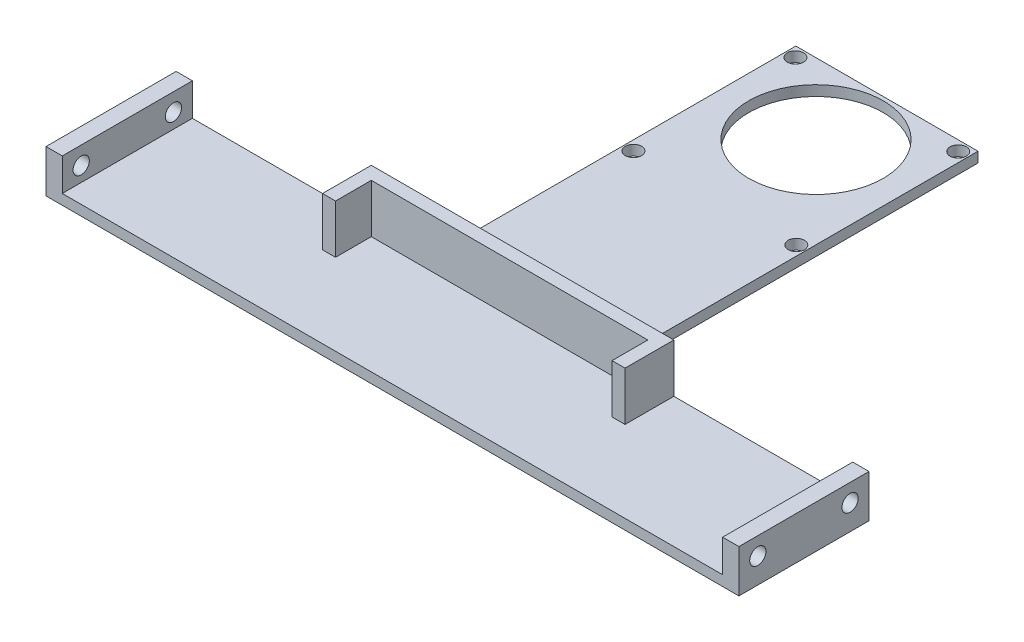
ISO-10303-21;
HEADER;
FILE_DESCRIPTION(('STEP AP214'),'2;1');
FILE_NAME('part.step','',(''),(''),'','','');
FILE_SCHEMA(('AUTOMOTIVE_DESIGN { 1 0 10303 214 1 1 1 1 }'));
ENDSEC;
DATA;
#1=APPLICATION_CONTEXT('core data for automotive mechanical design processes');
#2=APPLICATION_PROTOCOL_DEFINITION('international standard','automotive_design',2000,#1);
#3=PRODUCT_CONTEXT('',#1,'mechanical');
#4=PRODUCT('Part','Part','',(#3));
#5=PRODUCT_RELATED_PRODUCT_CATEGORY('part','',(#4));
#6=PRODUCT_DEFINITION_FORMATION('','',#4);
#7=PRODUCT_DEFINITION_CONTEXT('part definition',#1,'design');
#8=PRODUCT_DEFINITION('design','',#6,#7);
#9=PRODUCT_DEFINITION_SHAPE('','',#8);
#10=(LENGTH_UNIT() NAMED_UNIT(*) SI_UNIT(.MILLI.,.METRE.));
#11=(NAMED_UNIT(*) PLANE_ANGLE_UNIT() SI_UNIT($,.RADIAN.));
#12=(NAMED_UNIT(*) SI_UNIT($,.STERADIAN.) SOLID_ANGLE_UNIT());
#13=UNCERTAINTY_MEASURE_WITH_UNIT(LENGTH_MEASURE(1.E-05),#10,'distance_accuracy_value','');
#14=(GEOMETRIC_REPRESENTATION_CONTEXT(3) GLOBAL_UNCERTAINTY_ASSIGNED_CONTEXT((#13)) GLOBAL_UNIT_ASSIGNED_CONTEXT((#10,
#11,#12)) REPRESENTATION_CONTEXT('',''));
#15=CARTESIAN_POINT('',(0.,0.,0.));
#16=DIRECTION('',(0.,0.,1.));
#17=DIRECTION('',(1.,0.,0.));
#18=AXIS2_PLACEMENT_3D('',#15,#16,#17);
#19=CARTESIAN_POINT('',(56.515,2.,-167.64));
#20=DIRECTION('',(0.,0.,1.));
#21=DIRECTION('',(1.,0.,0.));
#22=AXIS2_PLACEMENT_3D('',#19,#20,#21);
#23=PLANE('',#22);
#24=DIRECTION('',(0.,-1.,0.));
#25=VECTOR('',#24,1.);
#26=CARTESIAN_POINT('',(44.7675,2.,-167.64));
#27=LINE('',#26,#25);
#28=CARTESIAN_POINT('',(44.7675,4.54,-167.64));
#29=VERTEX_POINT('',#28);
#30=CARTESIAN_POINT('',(44.7675,0.,-167.64));
#31=VERTEX_POINT('',#30);
#32=EDGE_CURVE('E61',#29,#31,#27,.T.);
#33=ORIENTED_EDGE('',*,*,#32,.F.);
#34=DIRECTION('',(1.,0.,0.));
#35=VECTOR('',#34,1.);
#36=CARTESIAN_POINT('',(56.515,4.54,-167.64));
#37=LINE('',#36,#35);
#38=CARTESIAN_POINT('',(9.20750000000003,4.54,-167.64));
#39=VERTEX_POINT('',#38);
#40=EDGE_CURVE('E446',#29,#39,#37,.F.);
#41=ORIENTED_EDGE('',*,*,#40,.T.);
#42=DIRECTION('',(0.,-1.,0.));
#43=VECTOR('',#42,1.);
#44=CARTESIAN_POINT('',(9.20750000000003,2.,-167.64));
#45=LINE('',#44,#43);
#46=CARTESIAN_POINT('',(9.20750000000004,0.,-167.64));
#47=VERTEX_POINT('',#46);
#48=EDGE_CURVE('E68',#39,#47,#45,.T.);
#49=ORIENTED_EDGE('',*,*,#48,.T.);
#50=DIRECTION('',(-1.,0.,0.));
#51=VECTOR('',#50,1.);
#52=CARTESIAN_POINT('',(56.515,0.,-167.64));
#53=LINE('',#52,#51);
#54=CARTESIAN_POINT('',(-40.6399999999999,0.,-167.64));
#55=VERTEX_POINT('',#54);
#56=EDGE_CURVE('E435',#47,#55,#53,.T.);
#57=ORIENTED_EDGE('',*,*,#56,.T.);
#58=DIRECTION('',(0.,-1.,0.));
#59=VECTOR('',#58,1.);
#60=CARTESIAN_POINT('',(-40.6399999999999,2.,-167.64));
#61=LINE('',#60,#59);
#62=CARTESIAN_POINT('',(-40.6399999999999,8.35,-167.64));
#63=VERTEX_POINT('',#62);
#64=EDGE_CURVE('E283',#63,#55,#61,.T.);
#65=ORIENTED_EDGE('',*,*,#64,.F.);
#66=DIRECTION('',(-1.,0.,0.));
#67=VECTOR('',#66,1.);
#68=CARTESIAN_POINT('',(53.9750000000001,8.35,-167.64));
#69=LINE('',#68,#67);
#70=CARTESIAN_POINT('',(-37.4649999999999,8.35,-167.64));
#71=VERTEX_POINT('',#70);
#72=EDGE_CURVE('E261',#71,#63,#69,.T.);
#73=ORIENTED_EDGE('',*,*,#72,.F.);
#74=DIRECTION('',(0.,-1.,0.));
#75=VECTOR('',#74,1.);
#76=CARTESIAN_POINT('',(-37.4649999999999,8.35,-167.64));
#77=LINE('',#76,#75);
#78=CARTESIAN_POINT('',(-37.4649999999999,2.,-167.64));
#79=VERTEX_POINT('',#78);
#80=EDGE_CURVE('E269',#71,#79,#77,.T.);
#81=ORIENTED_EDGE('',*,*,#80,.T.);
#82=DIRECTION('',(1.,0.,0.));
#83=VECTOR('',#82,1.);
#84=CARTESIAN_POINT('',(-2.53999999999989,2.,-167.64));
#85=LINE('',#84,#83);
#86=CARTESIAN_POINT('',(-2.54,2.,-167.64));
#87=VERTEX_POINT('',#86);
#88=EDGE_CURVE('E276',#79,#87,#85,.T.);
#89=ORIENTED_EDGE('',*,*,#88,.T.);
#90=DIRECTION('',(0.,-1.,0.));
#91=VECTOR('',#90,1.);
#92=CARTESIAN_POINT('',(-2.54,2.,-167.64));
#93=LINE('',#92,#91);
#94=CARTESIAN_POINT('',(-2.54,11.525,-167.64));
#95=VERTEX_POINT('',#94);
#96=EDGE_CURVE('E431',#95,#87,#93,.T.);
#97=ORIENTED_EDGE('',*,*,#96,.F.);
#98=DIRECTION('',(1.,0.,0.));
#99=VECTOR('',#98,1.);
#100=CARTESIAN_POINT('',(0.,11.525,-167.64));
#101=LINE('',#100,#99);
#102=CARTESIAN_POINT('',(56.515,11.525,-167.64));
#103=VERTEX_POINT('',#102);
#104=EDGE_CURVE('E360',#95,#103,#101,.T.);
#105=ORIENTED_EDGE('',*,*,#104,.T.);
#106=DIRECTION('',(0.,-1.,0.));
#107=VECTOR('',#106,1.);
#108=CARTESIAN_POINT('',(56.515,2.,-167.64));
#109=LINE('',#108,#107);
#110=CARTESIAN_POINT('',(56.515,2.,-167.64));
#111=VERTEX_POINT('',#110);
#112=EDGE_CURVE('E440',#103,#111,#109,.T.);
#113=ORIENTED_EDGE('',*,*,#112,.T.);
#114=DIRECTION('',(-1.,0.,0.));
#115=VECTOR('',#114,1.);
#116=CARTESIAN_POINT('',(56.515,2.,-167.64));
#117=LINE('',#116,#115);
#118=CARTESIAN_POINT('',(91.44,2.,-167.64));
#119=VERTEX_POINT('',#118);
#120=EDGE_CURVE('E338',#119,#111,#117,.T.);
#121=ORIENTED_EDGE('',*,*,#120,.F.);
#122=DIRECTION('',(0.,-1.,0.));
#123=VECTOR('',#122,1.);
#124=CARTESIAN_POINT('',(91.44,8.35,-167.64));
#125=LINE('',#124,#123);
#126=CARTESIAN_POINT('',(91.44,8.35,-167.64));
#127=VERTEX_POINT('',#126);
#128=EDGE_CURVE('E330',#127,#119,#125,.T.);
#129=ORIENTED_EDGE('',*,*,#128,.F.);
#130=DIRECTION('',(1.,0.,0.));
#131=VECTOR('',#130,1.);
#132=CARTESIAN_POINT('',(0.,8.35,-167.64));
#133=LINE('',#132,#131);
#134=CARTESIAN_POINT('',(94.615,8.35,-167.64));
#135=VERTEX_POINT('',#134);
#136=EDGE_CURVE('E323',#127,#135,#133,.T.);
#137=ORIENTED_EDGE('',*,*,#136,.T.);
#138=DIRECTION('',(0.,-1.,0.));
#139=VECTOR('',#138,1.);
#140=CARTESIAN_POINT('',(94.615,2.,-167.64));
#141=LINE('',#140,#139);
#142=CARTESIAN_POINT('',(94.615,0.,-167.64));
#143=VERTEX_POINT('',#142);
#144=EDGE_CURVE('E344',#135,#143,#141,.T.);
#145=ORIENTED_EDGE('',*,*,#144,.T.);
#146=EDGE_CURVE('E432',#143,#31,#53,.T.);
#147=ORIENTED_EDGE('',*,*,#146,.T.);
#148=EDGE_LOOP('',(#33,#41,#49,#57,#65,#73,#81,#89,#97,#105,#113,#121,#129,#137,#145,#147));
#149=FACE_BOUND('',#148,.T.);
#150=ADVANCED_FACE('F45',(#149),#23,.F.);
#151=CARTESIAN_POINT('',(56.515,2.,-142.24));
#152=DIRECTION('',(-1.,0.,0.));
#153=DIRECTION('',(0.,0.,1.));
#154=AXIS2_PLACEMENT_3D('',#151,#152,#153);
#155=PLANE('',#154);
#156=DIRECTION('',(0.,0.,1.));
#157=VECTOR('',#156,1.);
#158=CARTESIAN_POINT('',(56.515,2.,-167.64));
#159=LINE('',#158,#157);
#160=CARTESIAN_POINT('',(56.515,2.,-158.115));
#161=VERTEX_POINT('',#160);
#162=EDGE_CURVE('E341',#111,#161,#159,.T.);
#163=ORIENTED_EDGE('',*,*,#162,.F.);
#164=ORIENTED_EDGE('',*,*,#112,.F.);
#165=DIRECTION('',(0.,0.,1.));
#166=VECTOR('',#165,1.);
#167=CARTESIAN_POINT('',(56.515,11.525,0.));
#168=LINE('',#167,#166);
#169=CARTESIAN_POINT('',(56.515,11.525,-158.115));
#170=VERTEX_POINT('',#169);
#171=EDGE_CURVE('E365',#103,#170,#168,.T.);
#172=ORIENTED_EDGE('',*,*,#171,.T.);
#173=DIRECTION('',(0.,-1.,0.));
#174=VECTOR('',#173,1.);
#175=CARTESIAN_POINT('',(56.515,11.525,-158.115));
#176=LINE('',#175,#174);
#177=EDGE_CURVE('E389',#170,#161,#176,.T.);
#178=ORIENTED_EDGE('',*,*,#177,.T.);
#179=EDGE_LOOP('',(#163,#164,#172,#178));
#180=FACE_BOUND('',#179,.T.);
#181=ADVANCED_FACE('F506',(#180),#155,.F.);
#182=CARTESIAN_POINT('',(0.,2.,0.));
#183=DIRECTION('',(0.,1.,0.));
#184=DIRECTION('',(0.,0.,1.));
#185=AXIS2_PLACEMENT_3D('',#182,#183,#184);
#186=PLANE('',#185);
#187=DIRECTION('',(1.,0.,0.));
#188=VECTOR('',#187,1.);
#189=CARTESIAN_POINT('',(-2.54,2.,-142.24));
#190=LINE('',#189,#188);
#191=CARTESIAN_POINT('',(-37.4649999999999,2.,-142.24));
#192=VERTEX_POINT('',#191);
#193=CARTESIAN_POINT('',(91.44,2.,-142.24));
#194=VERTEX_POINT('',#193);
#195=EDGE_CURVE('E428',#192,#194,#190,.T.);
#196=ORIENTED_EDGE('',*,*,#195,.T.);
#197=DIRECTION('',(0.,0.,-1.));
#198=VECTOR('',#197,1.);
#199=CARTESIAN_POINT('',(91.44,2.,0.));
#200=LINE('',#199,#198);
#201=EDGE_CURVE('E304',#194,#119,#200,.T.);
#202=ORIENTED_EDGE('',*,*,#201,.T.);
#203=ORIENTED_EDGE('',*,*,#120,.T.);
#204=ORIENTED_EDGE('',*,*,#162,.T.);
#205=DIRECTION('',(-1.,0.,0.));
#206=VECTOR('',#205,1.);
#207=CARTESIAN_POINT('',(0.,2.,-158.115));
#208=LINE('',#207,#206);
#209=CARTESIAN_POINT('',(53.975,2.,-158.115));
#210=VERTEX_POINT('',#209);
#211=EDGE_CURVE('E355',#161,#210,#208,.T.);
#212=ORIENTED_EDGE('',*,*,#211,.T.);
#213=DIRECTION('',(0.,0.,-1.));
#214=VECTOR('',#213,1.);
#215=CARTESIAN_POINT('',(53.975,2.,0.));
#216=LINE('',#215,#214);
#217=CARTESIAN_POINT('',(53.975,2.,-165.1));
#218=VERTEX_POINT('',#217);
#219=EDGE_CURVE('E393',#210,#218,#216,.T.);
#220=ORIENTED_EDGE('',*,*,#219,.T.);
#221=DIRECTION('',(-1.,0.,0.));
#222=VECTOR('',#221,1.);
#223=CARTESIAN_POINT('',(0.,2.,-165.1));
#224=LINE('',#223,#222);
#225=CARTESIAN_POINT('',(0.,2.,-165.1));
#226=VERTEX_POINT('',#225);
#227=EDGE_CURVE('E397',#218,#226,#224,.T.);
#228=ORIENTED_EDGE('',*,*,#227,.T.);
#229=DIRECTION('',(0.,0.,1.));
#230=VECTOR('',#229,1.);
#231=CARTESIAN_POINT('',(0.,2.,0.));
#232=LINE('',#231,#230);
#233=CARTESIAN_POINT('',(0.,2.,-158.115));
#234=VERTEX_POINT('',#233);
#235=EDGE_CURVE('E401',#226,#234,#232,.T.);
#236=ORIENTED_EDGE('',*,*,#235,.T.);
#237=DIRECTION('',(-1.,0.,0.));
#238=VECTOR('',#237,1.);
#239=CARTESIAN_POINT('',(0.,2.,-158.115));
#240=LINE('',#239,#238);
#241=CARTESIAN_POINT('',(-2.54,2.,-158.115));
#242=VERTEX_POINT('',#241);
#243=EDGE_CURVE('E361',#234,#242,#240,.T.);
#244=ORIENTED_EDGE('',*,*,#243,.T.);
#245=DIRECTION('',(0.,0.,1.));
#246=VECTOR('',#245,1.);
#247=CARTESIAN_POINT('',(-2.53999999999989,2.,-167.64));
#248=LINE('',#247,#246);
#249=EDGE_CURVE('E280',#87,#242,#248,.T.);
#250=ORIENTED_EDGE('',*,*,#249,.F.);
#251=ORIENTED_EDGE('',*,*,#88,.F.);
#252=DIRECTION('',(0.,0.,-1.));
#253=VECTOR('',#252,1.);
#254=CARTESIAN_POINT('',(-37.4649999999999,2.,0.));
#255=LINE('',#254,#253);
#256=EDGE_CURVE('E244',#192,#79,#255,.T.);
#257=ORIENTED_EDGE('',*,*,#256,.F.);
#258=EDGE_LOOP('',(#196,#202,#203,#204,#212,#220,#228,#236,#244,#250,#251,#257));
#259=FACE_BOUND('',#258,.T.);
#260=ADVANCED_FACE('F475',(#259),#186,.T.);
#261=CARTESIAN_POINT('',(-2.54,2.,-167.64));
#262=DIRECTION('',(1.,0.,0.));
#263=DIRECTION('',(0.,0.,-1.));
#264=AXIS2_PLACEMENT_3D('',#261,#262,#263);
#265=PLANE('',#264);
#266=ORIENTED_EDGE('',*,*,#96,.T.);
#267=ORIENTED_EDGE('',*,*,#249,.T.);
#268=DIRECTION('',(0.,-1.,0.));
#269=VECTOR('',#268,1.);
#270=CARTESIAN_POINT('',(-2.54,11.525,-158.115));
#271=LINE('',#270,#269);
#272=CARTESIAN_POINT('',(-2.54,11.525,-158.115));
#273=VERTEX_POINT('',#272);
#274=EDGE_CURVE('E408',#273,#242,#271,.T.);
#275=ORIENTED_EDGE('',*,*,#274,.F.);
#276=DIRECTION('',(0.,0.,-1.));
#277=VECTOR('',#276,1.);
#278=CARTESIAN_POINT('',(-2.54,11.525,0.));
#279=LINE('',#278,#277);
#280=EDGE_CURVE('E356',#273,#95,#279,.T.);
#281=ORIENTED_EDGE('',*,*,#280,.T.);
#282=EDGE_LOOP('',(#266,#267,#275,#281));
#283=FACE_BOUND('',#282,.T.);
#284=ADVANCED_FACE('F485',(#283),#265,.F.);
#285=CARTESIAN_POINT('',(-2.54,2.,-142.24));
#286=DIRECTION('',(0.,0.,-1.));
#287=DIRECTION('',(-1.,0.,0.));
#288=AXIS2_PLACEMENT_3D('',#285,#286,#287);
#289=PLANE('',#288);
#290=DIRECTION('',(1.,0.,0.));
#291=VECTOR('',#290,1.);
#292=CARTESIAN_POINT('',(-2.54,0.,-142.24));
#293=LINE('',#292,#291);
#294=CARTESIAN_POINT('',(-40.6399999999999,0.,-142.24));
#295=VERTEX_POINT('',#294);
#296=CARTESIAN_POINT('',(94.615,0.,-142.24));
#297=VERTEX_POINT('',#296);
#298=EDGE_CURVE('E412',#295,#297,#293,.T.);
#299=ORIENTED_EDGE('',*,*,#298,.T.);
#300=DIRECTION('',(0.,-1.,0.));
#301=VECTOR('',#300,1.);
#302=CARTESIAN_POINT('',(94.615,2.,-142.24));
#303=LINE('',#302,#301);
#304=CARTESIAN_POINT('',(94.615,8.35,-142.24));
#305=VERTEX_POINT('',#304);
#306=EDGE_CURVE('E351',#305,#297,#303,.T.);
#307=ORIENTED_EDGE('',*,*,#306,.F.);
#308=DIRECTION('',(-1.,0.,0.));
#309=VECTOR('',#308,1.);
#310=CARTESIAN_POINT('',(0.,8.35,-142.24));
#311=LINE('',#310,#309);
#312=CARTESIAN_POINT('',(91.44,8.35,-142.24));
#313=VERTEX_POINT('',#312);
#314=EDGE_CURVE('E315',#305,#313,#311,.T.);
#315=ORIENTED_EDGE('',*,*,#314,.T.);
#316=DIRECTION('',(0.,-1.,0.));
#317=VECTOR('',#316,1.);
#318=CARTESIAN_POINT('',(91.44,8.35,-142.24));
#319=LINE('',#318,#317);
#320=EDGE_CURVE('E327',#313,#194,#319,.T.);
#321=ORIENTED_EDGE('',*,*,#320,.T.);
#322=ORIENTED_EDGE('',*,*,#195,.F.);
#323=DIRECTION('',(0.,-1.,0.));
#324=VECTOR('',#323,1.);
#325=CARTESIAN_POINT('',(-37.4649999999999,8.35,-142.24));
#326=LINE('',#325,#324);
#327=CARTESIAN_POINT('',(-37.4649999999999,8.35,-142.24));
#328=VERTEX_POINT('',#327);
#329=EDGE_CURVE('E265',#328,#192,#326,.T.);
#330=ORIENTED_EDGE('',*,*,#329,.F.);
#331=DIRECTION('',(1.,0.,0.));
#332=VECTOR('',#331,1.);
#333=CARTESIAN_POINT('',(53.9750000000001,8.35,-142.24));
#334=LINE('',#333,#332);
#335=CARTESIAN_POINT('',(-40.6399999999999,8.35,-142.24));
#336=VERTEX_POINT('',#335);
#337=EDGE_CURVE('E254',#336,#328,#334,.T.);
#338=ORIENTED_EDGE('',*,*,#337,.F.);
#339=DIRECTION('',(0.,-1.,0.));
#340=VECTOR('',#339,1.);
#341=CARTESIAN_POINT('',(-40.6399999999999,2.,-142.24));
#342=LINE('',#341,#340);
#343=EDGE_CURVE('E290',#336,#295,#342,.T.);
#344=ORIENTED_EDGE('',*,*,#343,.T.);
#345=EDGE_LOOP('',(#299,#307,#315,#321,#322,#330,#338,#344));
#346=FACE_BOUND('',#345,.T.);
#347=ADVANCED_FACE('F580',(#346),#289,.F.);
#348=CARTESIAN_POINT('',(0.,0.,0.));
#349=DIRECTION('',(0.,1.,0.));
#350=DIRECTION('',(0.,0.,1.));
#351=AXIS2_PLACEMENT_3D('',#348,#349,#350);
#352=PLANE('',#351);
#353=CARTESIAN_POINT('',(26.9875,0.,-224.917));
#354=DIRECTION('',(0.,1.,0.));
#355=DIRECTION('',(0.,0.,1.));
#356=AXIS2_PLACEMENT_3D('',#353,#354,#355);
#357=CIRCLE('',#356,13.129221828544);
#358=CARTESIAN_POINT('',(26.9875,0.,-211.787778171456));
#359=VERTEX_POINT('',#358);
#360=EDGE_CURVE('E550',#359,#359,#357,.F.);
#361=ORIENTED_EDGE('',*,*,#360,.F.);
#362=EDGE_LOOP('',(#361));
#363=FACE_BOUND('',#362,.T.);
#364=DIRECTION('',(0.,0.,-1.));
#365=VECTOR('',#364,1.);
#366=CARTESIAN_POINT('',(-40.6399999999999,0.,-167.64));
#367=LINE('',#366,#365);
#368=EDGE_CURVE('E272',#295,#55,#367,.T.);
#369=ORIENTED_EDGE('',*,*,#368,.T.);
#370=ORIENTED_EDGE('',*,*,#56,.F.);
#371=DIRECTION('',(0.,0.,1.));
#372=VECTOR('',#371,1.);
#373=CARTESIAN_POINT('',(9.20750000000003,0.,-238.76));
#374=LINE('',#373,#372);
#375=CARTESIAN_POINT('',(9.20750000000003,0.,-238.76));
#376=VERTEX_POINT('',#375);
#377=EDGE_CURVE('E221',#376,#47,#374,.T.);
#378=ORIENTED_EDGE('',*,*,#377,.F.);
#379=DIRECTION('',(-1.,0.,0.));
#380=VECTOR('',#379,1.);
#381=CARTESIAN_POINT('',(9.20750000000003,0.,-238.76));
#382=LINE('',#381,#380);
#383=CARTESIAN_POINT('',(44.7675,0.,-238.76));
#384=VERTEX_POINT('',#383);
#385=EDGE_CURVE('E227',#384,#376,#382,.T.);
#386=ORIENTED_EDGE('',*,*,#385,.F.);
#387=DIRECTION('',(0.,0.,-1.));
#388=VECTOR('',#387,1.);
#389=CARTESIAN_POINT('',(44.7675,0.,-238.76));
#390=LINE('',#389,#388);
#391=EDGE_CURVE('E206',#31,#384,#390,.T.);
#392=ORIENTED_EDGE('',*,*,#391,.F.);
#393=ORIENTED_EDGE('',*,*,#146,.F.);
#394=DIRECTION('',(0.,0.,-1.));
#395=VECTOR('',#394,1.);
#396=CARTESIAN_POINT('',(94.615,0.,-167.64));
#397=LINE('',#396,#395);
#398=EDGE_CURVE('E334',#297,#143,#397,.T.);
#399=ORIENTED_EDGE('',*,*,#398,.F.);
#400=ORIENTED_EDGE('',*,*,#298,.F.);
#401=EDGE_LOOP('',(#369,#370,#378,#386,#392,#393,#399,#400));
#402=FACE_BOUND('',#401,.T.);
#403=CARTESIAN_POINT('',(11.0905168800607,0.,-236.783908574252));
#404=DIRECTION('',(0.,1.,0.));
#405=DIRECTION('',(0.,0.,1.));
#406=AXIS2_PLACEMENT_3D('',#403,#404,#405);
#407=CIRCLE('',#406,1.5875);
#408=CARTESIAN_POINT('',(11.0905168800607,0.,-235.196408574252));
#409=VERTEX_POINT('',#408);
#410=EDGE_CURVE('E522',#409,#409,#407,.T.);
#411=ORIENTED_EDGE('',*,*,#410,.T.);
#412=EDGE_LOOP('',(#411));
#413=FACE_BOUND('',#412,.T.);
#414=CARTESIAN_POINT('',(11.0905168800607,0.,-205.176091425748));
#415=DIRECTION('',(0.,1.,0.));
#416=DIRECTION('',(0.,0.,-1.));
#417=AXIS2_PLACEMENT_3D('',#414,#415,#416);
#418=CIRCLE('',#417,1.5875);
#419=CARTESIAN_POINT('',(11.0905168800607,0.,-206.763591425748));
#420=VERTEX_POINT('',#419);
#421=EDGE_CURVE('E530',#420,#420,#418,.T.);
#422=ORIENTED_EDGE('',*,*,#421,.T.);
#423=EDGE_LOOP('',(#422));
#424=FACE_BOUND('',#423,.T.);
#425=CARTESIAN_POINT('',(42.8844831199394,0.,-205.176091425748));
#426=DIRECTION('',(0.,1.,0.));
#427=DIRECTION('',(0.,0.,1.));
#428=AXIS2_PLACEMENT_3D('',#425,#426,#427);
#429=CIRCLE('',#428,1.5875);
#430=CARTESIAN_POINT('',(42.8844831199394,0.,-203.588591425748));
#431=VERTEX_POINT('',#430);
#432=EDGE_CURVE('E538',#431,#431,#429,.T.);
#433=ORIENTED_EDGE('',*,*,#432,.T.);
#434=EDGE_LOOP('',(#433));
#435=FACE_BOUND('',#434,.T.);
#436=CARTESIAN_POINT('',(42.8844831199394,0.,-236.783908574252));
#437=DIRECTION('',(0.,1.,0.));
#438=DIRECTION('',(0.,0.,-1.));
#439=AXIS2_PLACEMENT_3D('',#436,#437,#438);
#440=CIRCLE('',#439,1.5875);
#441=CARTESIAN_POINT('',(42.8844831199394,0.,-238.371408574252));
#442=VERTEX_POINT('',#441);
#443=EDGE_CURVE('E546',#442,#442,#440,.T.);
#444=ORIENTED_EDGE('',*,*,#443,.T.);
#445=EDGE_LOOP('',(#444));
#446=FACE_BOUND('',#445,.T.);
#447=ADVANCED_FACE('F456',(#363,#402,#413,#424,#435,#446),#352,.F.);
#448=CARTESIAN_POINT('',(0.,11.525,-158.115));
#449=DIRECTION('',(0.,0.,1.));
#450=DIRECTION('',(1.,0.,0.));
#451=AXIS2_PLACEMENT_3D('',#448,#449,#450);
#452=PLANE('',#451);
#453=ORIENTED_EDGE('',*,*,#243,.F.);
#454=DIRECTION('',(0.,-1.,0.));
#455=VECTOR('',#454,1.);
#456=CARTESIAN_POINT('',(0.,11.525,-158.115));
#457=LINE('',#456,#455);
#458=CARTESIAN_POINT('',(0.,11.525,-158.115));
#459=VERTEX_POINT('',#458);
#460=EDGE_CURVE('E413',#459,#234,#457,.T.);
#461=ORIENTED_EDGE('',*,*,#460,.F.);
#462=DIRECTION('',(-1.,0.,0.));
#463=VECTOR('',#462,1.);
#464=CARTESIAN_POINT('',(0.,11.525,-158.115));
#465=LINE('',#464,#463);
#466=EDGE_CURVE('E385',#459,#273,#465,.T.);
#467=ORIENTED_EDGE('',*,*,#466,.T.);
#468=ORIENTED_EDGE('',*,*,#274,.T.);
#469=EDGE_LOOP('',(#453,#461,#467,#468));
#470=FACE_BOUND('',#469,.T.);
#471=ADVANCED_FACE('F488',(#470),#452,.T.);
#472=CARTESIAN_POINT('',(0.,11.525,0.));
#473=DIRECTION('',(1.,0.,0.));
#474=DIRECTION('',(0.,0.,-1.));
#475=AXIS2_PLACEMENT_3D('',#472,#473,#474);
#476=PLANE('',#475);
#477=ORIENTED_EDGE('',*,*,#235,.F.);
#478=DIRECTION('',(0.,-1.,0.));
#479=VECTOR('',#478,1.);
#480=CARTESIAN_POINT('',(0.,11.525,-165.1));
#481=LINE('',#480,#479);
#482=CARTESIAN_POINT('',(0.,11.525,-165.1));
#483=VERTEX_POINT('',#482);
#484=EDGE_CURVE('E416',#483,#226,#481,.T.);
#485=ORIENTED_EDGE('',*,*,#484,.F.);
#486=DIRECTION('',(0.,0.,1.));
#487=VECTOR('',#486,1.);
#488=CARTESIAN_POINT('',(0.,11.525,0.));
#489=LINE('',#488,#487);
#490=EDGE_CURVE('E381',#483,#459,#489,.T.);
#491=ORIENTED_EDGE('',*,*,#490,.T.);
#492=ORIENTED_EDGE('',*,*,#460,.T.);
#493=EDGE_LOOP('',(#477,#485,#491,#492));
#494=FACE_BOUND('',#493,.T.);
#495=ADVANCED_FACE('F492',(#494),#476,.T.);
#496=CARTESIAN_POINT('',(0.,11.525,-165.1));
#497=DIRECTION('',(0.,0.,1.));
#498=DIRECTION('',(1.,0.,0.));
#499=AXIS2_PLACEMENT_3D('',#496,#497,#498);
#500=PLANE('',#499);
#501=ORIENTED_EDGE('',*,*,#227,.F.);
#502=DIRECTION('',(0.,-1.,0.));
#503=VECTOR('',#502,1.);
#504=CARTESIAN_POINT('',(53.975,11.525,-165.1));
#505=LINE('',#504,#503);
#506=CARTESIAN_POINT('',(53.975,11.525,-165.1));
#507=VERTEX_POINT('',#506);
#508=EDGE_CURVE('E419',#507,#218,#505,.T.);
#509=ORIENTED_EDGE('',*,*,#508,.F.);
#510=DIRECTION('',(-1.,0.,0.));
#511=VECTOR('',#510,1.);
#512=CARTESIAN_POINT('',(0.,11.525,-165.1));
#513=LINE('',#512,#511);
#514=EDGE_CURVE('E377',#507,#483,#513,.T.);
#515=ORIENTED_EDGE('',*,*,#514,.T.);
#516=ORIENTED_EDGE('',*,*,#484,.T.);
#517=EDGE_LOOP('',(#501,#509,#515,#516));
#518=FACE_BOUND('',#517,.T.);
#519=ADVANCED_FACE('F497',(#518),#500,.T.);
#520=CARTESIAN_POINT('',(53.975,11.525,0.));
#521=DIRECTION('',(-1.,0.,0.));
#522=DIRECTION('',(0.,0.,1.));
#523=AXIS2_PLACEMENT_3D('',#520,#521,#522);
#524=PLANE('',#523);
#525=ORIENTED_EDGE('',*,*,#219,.F.);
#526=DIRECTION('',(0.,-1.,0.));
#527=VECTOR('',#526,1.);
#528=CARTESIAN_POINT('',(53.975,11.525,-158.115));
#529=LINE('',#528,#527);
#530=CARTESIAN_POINT('',(53.975,11.525,-158.115));
#531=VERTEX_POINT('',#530);
#532=EDGE_CURVE('E422',#531,#210,#529,.T.);
#533=ORIENTED_EDGE('',*,*,#532,.F.);
#534=DIRECTION('',(0.,0.,-1.));
#535=VECTOR('',#534,1.);
#536=CARTESIAN_POINT('',(53.975,11.525,0.));
#537=LINE('',#536,#535);
#538=EDGE_CURVE('E373',#531,#507,#537,.T.);
#539=ORIENTED_EDGE('',*,*,#538,.T.);
#540=ORIENTED_EDGE('',*,*,#508,.T.);
#541=EDGE_LOOP('',(#525,#533,#539,#540));
#542=FACE_BOUND('',#541,.T.);
#543=ADVANCED_FACE('F500',(#542),#524,.T.);
#544=CARTESIAN_POINT('',(0.,11.525,-158.115));
#545=DIRECTION('',(0.,0.,1.));
#546=DIRECTION('',(1.,0.,0.));
#547=AXIS2_PLACEMENT_3D('',#544,#545,#546);
#548=PLANE('',#547);
#549=ORIENTED_EDGE('',*,*,#211,.F.);
#550=ORIENTED_EDGE('',*,*,#177,.F.);
#551=DIRECTION('',(-1.,0.,0.));
#552=VECTOR('',#551,1.);
#553=CARTESIAN_POINT('',(0.,11.525,-158.115));
#554=LINE('',#553,#552);
#555=EDGE_CURVE('E369',#170,#531,#554,.T.);
#556=ORIENTED_EDGE('',*,*,#555,.T.);
#557=ORIENTED_EDGE('',*,*,#532,.T.);
#558=EDGE_LOOP('',(#549,#550,#556,#557));
#559=FACE_BOUND('',#558,.T.);
#560=ADVANCED_FACE('F503',(#559),#548,.T.);
#561=CARTESIAN_POINT('',(0.,11.525,0.));
#562=DIRECTION('',(0.,-1.,0.));
#563=DIRECTION('',(0.,0.,-1.));
#564=AXIS2_PLACEMENT_3D('',#561,#562,#563);
#565=PLANE('',#564);
#566=ORIENTED_EDGE('',*,*,#280,.F.);
#567=ORIENTED_EDGE('',*,*,#466,.F.);
#568=ORIENTED_EDGE('',*,*,#490,.F.);
#569=ORIENTED_EDGE('',*,*,#514,.F.);
#570=ORIENTED_EDGE('',*,*,#538,.F.);
#571=ORIENTED_EDGE('',*,*,#555,.F.);
#572=ORIENTED_EDGE('',*,*,#171,.F.);
#573=ORIENTED_EDGE('',*,*,#104,.F.);
#574=EDGE_LOOP('',(#566,#567,#568,#569,#570,#571,#572,#573));
#575=FACE_BOUND('',#574,.T.);
#576=ADVANCED_FACE('F482',(#575),#565,.F.);
#577=CARTESIAN_POINT('',(94.615,2.,-167.64));
#578=DIRECTION('',(-1.,0.,0.));
#579=DIRECTION('',(0.,0.,1.));
#580=AXIS2_PLACEMENT_3D('',#577,#578,#579);
#581=PLANE('',#580);
#582=CARTESIAN_POINT('',(94.615,4.8959716215613,-145.94));
#583=DIRECTION('',(1.,0.,0.));
#584=DIRECTION('',(0.,0.,-1.));
#585=AXIS2_PLACEMENT_3D('',#582,#583,#584);
#586=CIRCLE('',#585,1.58749999999999);
#587=CARTESIAN_POINT('',(94.615,4.8959716215613,-147.5275));
#588=VERTEX_POINT('',#587);
#589=EDGE_CURVE('E295',#588,#588,#586,.T.);
#590=ORIENTED_EDGE('',*,*,#589,.F.);
#591=EDGE_LOOP('',(#590));
#592=FACE_BOUND('',#591,.T.);
#593=CARTESIAN_POINT('',(94.615,4.8959716215613,-163.94));
#594=DIRECTION('',(1.,0.,0.));
#595=DIRECTION('',(0.,0.,1.));
#596=AXIS2_PLACEMENT_3D('',#593,#594,#595);
#597=CIRCLE('',#596,1.58749999999999);
#598=CARTESIAN_POINT('',(94.615,4.8959716215613,-162.3525));
#599=VERTEX_POINT('',#598);
#600=EDGE_CURVE('E300',#599,#599,#597,.T.);
#601=ORIENTED_EDGE('',*,*,#600,.F.);
#602=EDGE_LOOP('',(#601));
#603=FACE_BOUND('',#602,.T.);
#604=ORIENTED_EDGE('',*,*,#398,.T.);
#605=ORIENTED_EDGE('',*,*,#144,.F.);
#606=DIRECTION('',(0.,0.,1.));
#607=VECTOR('',#606,1.);
#608=CARTESIAN_POINT('',(94.615,8.35,0.));
#609=LINE('',#608,#607);
#610=EDGE_CURVE('E311',#135,#305,#609,.T.);
#611=ORIENTED_EDGE('',*,*,#610,.T.);
#612=ORIENTED_EDGE('',*,*,#306,.T.);
#613=EDGE_LOOP('',(#604,#605,#611,#612));
#614=FACE_BOUND('',#613,.T.);
#615=ADVANCED_FACE('F518',(#592,#603,#614),#581,.F.);
#616=CARTESIAN_POINT('',(91.44,8.35,0.));
#617=DIRECTION('',(-1.,0.,0.));
#618=DIRECTION('',(0.,0.,1.));
#619=AXIS2_PLACEMENT_3D('',#616,#617,#618);
#620=PLANE('',#619);
#621=CARTESIAN_POINT('',(91.44,4.8959716215613,-145.94));
#622=DIRECTION('',(-1.,0.,0.));
#623=DIRECTION('',(0.,0.,1.));
#624=AXIS2_PLACEMENT_3D('',#621,#622,#623);
#625=CIRCLE('',#624,1.58749999999999);
#626=CARTESIAN_POINT('',(91.44,4.8959716215613,-144.3525));
#627=VERTEX_POINT('',#626);
#628=EDGE_CURVE('E299',#627,#627,#625,.F.);
#629=ORIENTED_EDGE('',*,*,#628,.T.);
#630=EDGE_LOOP('',(#629));
#631=FACE_BOUND('',#630,.T.);
#632=CARTESIAN_POINT('',(91.44,4.8959716215613,-163.94));
#633=DIRECTION('',(-1.,0.,0.));
#634=DIRECTION('',(0.,0.,1.));
#635=AXIS2_PLACEMENT_3D('',#632,#633,#634);
#636=CIRCLE('',#635,1.58749999999999);
#637=CARTESIAN_POINT('',(91.44,4.8959716215613,-162.3525));
#638=VERTEX_POINT('',#637);
#639=EDGE_CURVE('E294',#638,#638,#636,.F.);
#640=ORIENTED_EDGE('',*,*,#639,.T.);
#641=EDGE_LOOP('',(#640));
#642=FACE_BOUND('',#641,.T.);
#643=ORIENTED_EDGE('',*,*,#201,.F.);
#644=ORIENTED_EDGE('',*,*,#320,.F.);
#645=DIRECTION('',(0.,0.,-1.));
#646=VECTOR('',#645,1.);
#647=CARTESIAN_POINT('',(91.44,8.35,0.));
#648=LINE('',#647,#646);
#649=EDGE_CURVE('E319',#313,#127,#648,.T.);
#650=ORIENTED_EDGE('',*,*,#649,.T.);
#651=ORIENTED_EDGE('',*,*,#128,.T.);
#652=EDGE_LOOP('',(#643,#644,#650,#651));
#653=FACE_BOUND('',#652,.T.);
#654=ADVANCED_FACE('F510',(#631,#642,#653),#620,.T.);
#655=CARTESIAN_POINT('',(0.,8.35,0.));
#656=DIRECTION('',(0.,-1.,0.));
#657=DIRECTION('',(0.,0.,-1.));
#658=AXIS2_PLACEMENT_3D('',#655,#656,#657);
#659=PLANE('',#658);
#660=ORIENTED_EDGE('',*,*,#610,.F.);
#661=ORIENTED_EDGE('',*,*,#136,.F.);
#662=ORIENTED_EDGE('',*,*,#649,.F.);
#663=ORIENTED_EDGE('',*,*,#314,.F.);
#664=EDGE_LOOP('',(#660,#661,#662,#663));
#665=FACE_BOUND('',#664,.T.);
#666=ADVANCED_FACE('F516',(#665),#659,.F.);
#667=CARTESIAN_POINT('',(86.9498719394655,4.8959716215613,-163.94));
#668=DIRECTION('',(1.,0.,0.));
#669=DIRECTION('',(0.,0.,-1.));
#670=AXIS2_PLACEMENT_3D('',#667,#668,#669);
#671=CYLINDRICAL_SURFACE('',#670,1.58749999999999);
#672=ORIENTED_EDGE('',*,*,#600,.T.);
#673=EDGE_LOOP('',(#672));
#674=FACE_BOUND('',#673,.T.);
#675=ORIENTED_EDGE('',*,*,#639,.F.);
#676=EDGE_LOOP('',(#675));
#677=FACE_BOUND('',#676,.T.);
#678=ADVANCED_FACE('F640',(#674,#677),#671,.F.);
#679=CARTESIAN_POINT('',(86.9498719394655,4.8959716215613,-145.94));
#680=DIRECTION('',(1.,0.,0.));
#681=DIRECTION('',(0.,0.,-1.));
#682=AXIS2_PLACEMENT_3D('',#679,#680,#681);
#683=CYLINDRICAL_SURFACE('',#682,1.58749999999999);
#684=ORIENTED_EDGE('',*,*,#589,.T.);
#685=EDGE_LOOP('',(#684));
#686=FACE_BOUND('',#685,.T.);
#687=ORIENTED_EDGE('',*,*,#628,.F.);
#688=EDGE_LOOP('',(#687));
#689=FACE_BOUND('',#688,.T.);
#690=ADVANCED_FACE('F643',(#686,#689),#683,.F.);
#691=CARTESIAN_POINT('',(-40.6399999999999,2.,-167.64));
#692=DIRECTION('',(1.,0.,0.));
#693=DIRECTION('',(0.,0.,1.));
#694=AXIS2_PLACEMENT_3D('',#691,#692,#693);
#695=PLANE('',#694);
#696=CARTESIAN_POINT('',(-40.6399999999999,4.8959716215613,-145.94));
#697=DIRECTION('',(1.,0.,0.));
#698=DIRECTION('',(0.,0.,-1.));
#699=AXIS2_PLACEMENT_3D('',#696,#697,#698);
#700=CIRCLE('',#699,1.58749999999999);
#701=CARTESIAN_POINT('',(-40.6399999999999,4.8959716215613,-147.5275));
#702=VERTEX_POINT('',#701);
#703=EDGE_CURVE('E235',#702,#702,#700,.T.);
#704=ORIENTED_EDGE('',*,*,#703,.T.);
#705=EDGE_LOOP('',(#704));
#706=FACE_BOUND('',#705,.T.);
#707=CARTESIAN_POINT('',(-40.6399999999999,4.8959716215613,-163.94));
#708=DIRECTION('',(1.,0.,0.));
#709=DIRECTION('',(0.,0.,1.));
#710=AXIS2_PLACEMENT_3D('',#707,#708,#709);
#711=CIRCLE('',#710,1.58749999999999);
#712=CARTESIAN_POINT('',(-40.6399999999999,4.8959716215613,-162.3525));
#713=VERTEX_POINT('',#712);
#714=EDGE_CURVE('E240',#713,#713,#711,.T.);
#715=ORIENTED_EDGE('',*,*,#714,.T.);
#716=EDGE_LOOP('',(#715));
#717=FACE_BOUND('',#716,.T.);
#718=ORIENTED_EDGE('',*,*,#368,.F.);
#719=ORIENTED_EDGE('',*,*,#343,.F.);
#720=DIRECTION('',(0.,0.,1.));
#721=VECTOR('',#720,1.);
#722=CARTESIAN_POINT('',(-40.6399999999999,8.35,0.));
#723=LINE('',#722,#721);
#724=EDGE_CURVE('E251',#63,#336,#723,.T.);
#725=ORIENTED_EDGE('',*,*,#724,.F.);
#726=ORIENTED_EDGE('',*,*,#64,.T.);
#727=EDGE_LOOP('',(#718,#719,#725,#726));
#728=FACE_BOUND('',#727,.T.);
#729=ADVANCED_FACE('F463',(#706,#717,#728),#695,.F.);
#730=CARTESIAN_POINT('',(-37.4649999999999,8.35,0.));
#731=DIRECTION('',(1.,0.,0.));
#732=DIRECTION('',(0.,0.,1.));
#733=AXIS2_PLACEMENT_3D('',#730,#731,#732);
#734=PLANE('',#733);
#735=CARTESIAN_POINT('',(-37.4649999999999,4.8959716215613,-145.94));
#736=DIRECTION('',(-1.,0.,0.));
#737=DIRECTION('',(0.,0.,1.));
#738=AXIS2_PLACEMENT_3D('',#735,#736,#737);
#739=CIRCLE('',#738,1.58749999999999);
#740=CARTESIAN_POINT('',(-37.4649999999999,4.8959716215613,-144.3525));
#741=VERTEX_POINT('',#740);
#742=EDGE_CURVE('E239',#741,#741,#739,.F.);
#743=ORIENTED_EDGE('',*,*,#742,.F.);
#744=EDGE_LOOP('',(#743));
#745=FACE_BOUND('',#744,.T.);
#746=CARTESIAN_POINT('',(-37.4649999999999,4.8959716215613,-163.94));
#747=DIRECTION('',(-1.,0.,0.));
#748=DIRECTION('',(0.,0.,1.));
#749=AXIS2_PLACEMENT_3D('',#746,#747,#748);
#750=CIRCLE('',#749,1.58749999999999);
#751=CARTESIAN_POINT('',(-37.4649999999999,4.8959716215613,-162.3525));
#752=VERTEX_POINT('',#751);
#753=EDGE_CURVE('E234',#752,#752,#750,.F.);
#754=ORIENTED_EDGE('',*,*,#753,.F.);
#755=EDGE_LOOP('',(#754));
#756=FACE_BOUND('',#755,.T.);
#757=ORIENTED_EDGE('',*,*,#256,.T.);
#758=ORIENTED_EDGE('',*,*,#80,.F.);
#759=DIRECTION('',(0.,0.,-1.));
#760=VECTOR('',#759,1.);
#761=CARTESIAN_POINT('',(-37.4649999999999,8.35,0.));
#762=LINE('',#761,#760);
#763=EDGE_CURVE('E258',#328,#71,#762,.T.);
#764=ORIENTED_EDGE('',*,*,#763,.F.);
#765=ORIENTED_EDGE('',*,*,#329,.T.);
#766=EDGE_LOOP('',(#757,#758,#764,#765));
#767=FACE_BOUND('',#766,.T.);
#768=ADVANCED_FACE('F472',(#745,#756,#767),#734,.T.);
#769=CARTESIAN_POINT('',(53.9750000000001,8.35,0.));
#770=DIRECTION('',(0.,-1.,0.));
#771=DIRECTION('',(0.,0.,-1.));
#772=AXIS2_PLACEMENT_3D('',#769,#770,#771);
#773=PLANE('',#772);
#774=ORIENTED_EDGE('',*,*,#724,.T.);
#775=ORIENTED_EDGE('',*,*,#337,.T.);
#776=ORIENTED_EDGE('',*,*,#763,.T.);
#777=ORIENTED_EDGE('',*,*,#72,.T.);
#778=EDGE_LOOP('',(#774,#775,#776,#777));
#779=FACE_BOUND('',#778,.T.);
#780=ADVANCED_FACE('F468',(#779),#773,.F.);
#781=CARTESIAN_POINT('',(-32.9748719394654,4.8959716215613,-163.94));
#782=DIRECTION('',(-1.,0.,0.));
#783=DIRECTION('',(0.,0.,-1.));
#784=AXIS2_PLACEMENT_3D('',#781,#782,#783);
#785=CYLINDRICAL_SURFACE('',#784,1.58749999999999);
#786=ORIENTED_EDGE('',*,*,#714,.F.);
#787=EDGE_LOOP('',(#786));
#788=FACE_BOUND('',#787,.T.);
#789=ORIENTED_EDGE('',*,*,#753,.T.);
#790=EDGE_LOOP('',(#789));
#791=FACE_BOUND('',#790,.T.);
#792=ADVANCED_FACE('F656',(#788,#791),#785,.F.);
#793=CARTESIAN_POINT('',(-32.9748719394654,4.8959716215613,-145.94));
#794=DIRECTION('',(-1.,0.,0.));
#795=DIRECTION('',(0.,0.,-1.));
#796=AXIS2_PLACEMENT_3D('',#793,#794,#795);
#797=CYLINDRICAL_SURFACE('',#796,1.58749999999999);
#798=ORIENTED_EDGE('',*,*,#703,.F.);
#799=EDGE_LOOP('',(#798));
#800=FACE_BOUND('',#799,.T.);
#801=ORIENTED_EDGE('',*,*,#742,.T.);
#802=EDGE_LOOP('',(#801));
#803=FACE_BOUND('',#802,.T.);
#804=ADVANCED_FACE('F566',(#800,#803),#797,.F.);
#805=CARTESIAN_POINT('',(0.,2.,0.));
#806=DIRECTION('',(0.,1.,0.));
#807=DIRECTION('',(0.,0.,1.));
#808=AXIS2_PLACEMENT_3D('',#805,#806,#807);
#809=PLANE('',#808);
#810=CARTESIAN_POINT('',(26.9875,2.,-224.917));
#811=DIRECTION('',(0.,1.,0.));
#812=DIRECTION('',(0.,0.,1.));
#813=AXIS2_PLACEMENT_3D('',#810,#811,#812);
#814=CIRCLE('',#813,13.129221828544);
#815=CARTESIAN_POINT('',(26.9875,2.,-211.787778171456));
#816=VERTEX_POINT('',#815);
#817=EDGE_CURVE('E557',#816,#816,#814,.T.);
#818=ORIENTED_EDGE('',*,*,#817,.F.);
#819=EDGE_LOOP('',(#818));
#820=FACE_BOUND('',#819,.T.);
#821=CARTESIAN_POINT('',(42.8844831199394,2.,-205.176091425748));
#822=DIRECTION('',(0.,1.,0.));
#823=DIRECTION('',(0.,0.,1.));
#824=AXIS2_PLACEMENT_3D('',#821,#822,#823);
#825=CIRCLE('',#824,1.5875);
#826=CARTESIAN_POINT('',(42.8844831199394,2.,-203.588591425748));
#827=VERTEX_POINT('',#826);
#828=EDGE_CURVE('E534',#827,#827,#825,.T.);
#829=ORIENTED_EDGE('',*,*,#828,.F.);
#830=EDGE_LOOP('',(#829));
#831=FACE_BOUND('',#830,.T.);
#832=CARTESIAN_POINT('',(11.0905168800607,2.,-236.783908574252));
#833=DIRECTION('',(0.,1.,0.));
#834=DIRECTION('',(0.,0.,1.));
#835=AXIS2_PLACEMENT_3D('',#832,#833,#834);
#836=CIRCLE('',#835,1.5875);
#837=CARTESIAN_POINT('',(11.0905168800607,2.,-235.196408574252));
#838=VERTEX_POINT('',#837);
#839=EDGE_CURVE('E224',#838,#838,#836,.T.);
#840=ORIENTED_EDGE('',*,*,#839,.F.);
#841=EDGE_LOOP('',(#840));
#842=FACE_BOUND('',#841,.T.);
#843=DIRECTION('',(0.,0.,1.));
#844=VECTOR('',#843,1.);
#845=CARTESIAN_POINT('',(9.20750000000003,2.,-238.76));
#846=LINE('',#845,#844);
#847=CARTESIAN_POINT('',(9.20750000000003,2.,-238.76));
#848=VERTEX_POINT('',#847);
#849=CARTESIAN_POINT('',(9.20750000000003,2.,-170.18));
#850=VERTEX_POINT('',#849);
#851=EDGE_CURVE('E200',#848,#850,#846,.T.);
#852=ORIENTED_EDGE('',*,*,#851,.T.);
#853=DIRECTION('',(1.,0.,0.));
#854=VECTOR('',#853,1.);
#855=CARTESIAN_POINT('',(0.,2.,-170.18));
#856=LINE('',#855,#854);
#857=CARTESIAN_POINT('',(44.7675,2.,-170.18));
#858=VERTEX_POINT('',#857);
#859=EDGE_CURVE('E197',#850,#858,#856,.T.);
#860=ORIENTED_EDGE('',*,*,#859,.T.);
#861=DIRECTION('',(0.,0.,-1.));
#862=VECTOR('',#861,1.);
#863=CARTESIAN_POINT('',(44.7675,2.,-238.76));
#864=LINE('',#863,#862);
#865=CARTESIAN_POINT('',(44.7675,2.,-238.76));
#866=VERTEX_POINT('',#865);
#867=EDGE_CURVE('E188',#858,#866,#864,.T.);
#868=ORIENTED_EDGE('',*,*,#867,.T.);
#869=DIRECTION('',(-1.,0.,0.));
#870=VECTOR('',#869,1.);
#871=CARTESIAN_POINT('',(9.20750000000003,2.,-238.76));
#872=LINE('',#871,#870);
#873=EDGE_CURVE('E194',#866,#848,#872,.T.);
#874=ORIENTED_EDGE('',*,*,#873,.T.);
#875=EDGE_LOOP('',(#852,#860,#868,#874));
#876=FACE_BOUND('',#875,.T.);
#877=CARTESIAN_POINT('',(11.0905168800607,2.,-205.176091425748));
#878=DIRECTION('',(0.,1.,0.));
#879=DIRECTION('',(0.,0.,-1.));
#880=AXIS2_PLACEMENT_3D('',#877,#878,#879);
#881=CIRCLE('',#880,1.5875);
#882=CARTESIAN_POINT('',(11.0905168800607,2.,-206.763591425748));
#883=VERTEX_POINT('',#882);
#884=EDGE_CURVE('E526',#883,#883,#881,.T.);
#885=ORIENTED_EDGE('',*,*,#884,.F.);
#886=EDGE_LOOP('',(#885));
#887=FACE_BOUND('',#886,.T.);
#888=CARTESIAN_POINT('',(42.8844831199394,2.,-236.783908574252));
#889=DIRECTION('',(0.,1.,0.));
#890=DIRECTION('',(0.,0.,-1.));
#891=AXIS2_PLACEMENT_3D('',#888,#889,#890);
#892=CIRCLE('',#891,1.5875);
#893=CARTESIAN_POINT('',(42.8844831199394,2.,-238.371408574252));
#894=VERTEX_POINT('',#893);
#895=EDGE_CURVE('E542',#894,#894,#892,.T.);
#896=ORIENTED_EDGE('',*,*,#895,.F.);
#897=EDGE_LOOP('',(#896));
#898=FACE_BOUND('',#897,.T.);
#899=ADVANCED_FACE('F191',(#820,#831,#842,#876,#887,#898),#809,.T.);
#900=CARTESIAN_POINT('',(9.20750000000003,2.,-238.76));
#901=DIRECTION('',(1.,0.,0.));
#902=DIRECTION('',(0.,0.,-1.));
#903=AXIS2_PLACEMENT_3D('',#900,#901,#902);
#904=PLANE('',#903);
#905=ORIENTED_EDGE('',*,*,#377,.T.);
#906=ORIENTED_EDGE('',*,*,#48,.F.);
#907=CARTESIAN_POINT('',(9.20750000000003,4.54,-170.18));
#908=DIRECTION('',(1.,0.,0.));
#909=DIRECTION('',(0.,0.,-1.));
#910=AXIS2_PLACEMENT_3D('',#907,#908,#909);
#911=CIRCLE('',#910,2.54);
#912=EDGE_CURVE('E11',#39,#850,#911,.T.);
#913=ORIENTED_EDGE('',*,*,#912,.T.);
#914=ORIENTED_EDGE('',*,*,#851,.F.);
#915=DIRECTION('',(0.,-1.,0.));
#916=VECTOR('',#915,1.);
#917=CARTESIAN_POINT('',(9.20750000000003,2.,-238.76));
#918=LINE('',#917,#916);
#919=EDGE_CURVE('E210',#848,#376,#918,.T.);
#920=ORIENTED_EDGE('',*,*,#919,.T.);
#921=EDGE_LOOP('',(#905,#906,#913,#914,#920));
#922=FACE_BOUND('',#921,.T.);
#923=ADVANCED_FACE('F519',(#922),#904,.F.);
#924=CARTESIAN_POINT('',(44.7675,2.,-238.76));
#925=DIRECTION('',(-1.,0.,0.));
#926=DIRECTION('',(0.,0.,1.));
#927=AXIS2_PLACEMENT_3D('',#924,#925,#926);
#928=PLANE('',#927);
#929=ORIENTED_EDGE('',*,*,#391,.T.);
#930=DIRECTION('',(0.,-1.,0.));
#931=VECTOR('',#930,1.);
#932=CARTESIAN_POINT('',(44.7675,2.,-238.76));
#933=LINE('',#932,#931);
#934=EDGE_CURVE('E203',#866,#384,#933,.T.);
#935=ORIENTED_EDGE('',*,*,#934,.F.);
#936=ORIENTED_EDGE('',*,*,#867,.F.);
#937=CARTESIAN_POINT('',(44.7675,4.54,-170.18));
#938=DIRECTION('',(-1.,0.,0.));
#939=DIRECTION('',(0.,0.,1.));
#940=AXIS2_PLACEMENT_3D('',#937,#938,#939);
#941=CIRCLE('',#940,2.54);
#942=EDGE_CURVE('E54',#858,#29,#941,.T.);
#943=ORIENTED_EDGE('',*,*,#942,.T.);
#944=ORIENTED_EDGE('',*,*,#32,.T.);
#945=EDGE_LOOP('',(#929,#935,#936,#943,#944));
#946=FACE_BOUND('',#945,.T.);
#947=ADVANCED_FACE('F204',(#946),#928,.F.);
#948=CARTESIAN_POINT('',(9.20750000000003,2.,-238.76));
#949=DIRECTION('',(0.,0.,1.));
#950=DIRECTION('',(1.,0.,0.));
#951=AXIS2_PLACEMENT_3D('',#948,#949,#950);
#952=PLANE('',#951);
#953=ORIENTED_EDGE('',*,*,#385,.T.);
#954=ORIENTED_EDGE('',*,*,#919,.F.);
#955=ORIENTED_EDGE('',*,*,#873,.F.);
#956=ORIENTED_EDGE('',*,*,#934,.T.);
#957=EDGE_LOOP('',(#953,#954,#955,#956));
#958=FACE_BOUND('',#957,.T.);
#959=ADVANCED_FACE('F212',(#958),#952,.F.);
#960=CARTESIAN_POINT('',(11.0905168800607,2.,-236.783908574252));
#961=DIRECTION('',(0.,-1.,0.));
#962=DIRECTION('',(0.,0.,-1.));
#963=AXIS2_PLACEMENT_3D('',#960,#961,#962);
#964=CYLINDRICAL_SURFACE('',#963,1.5875);
#965=ORIENTED_EDGE('',*,*,#839,.T.);
#966=EDGE_LOOP('',(#965));
#967=FACE_BOUND('',#966,.T.);
#968=ORIENTED_EDGE('',*,*,#410,.F.);
#969=EDGE_LOOP('',(#968));
#970=FACE_BOUND('',#969,.T.);
#971=ADVANCED_FACE('F572',(#967,#970),#964,.F.);
#972=CARTESIAN_POINT('',(11.0905168800607,2.,-205.176091425748));
#973=DIRECTION('',(0.,-1.,0.));
#974=DIRECTION('',(0.,0.,-1.));
#975=AXIS2_PLACEMENT_3D('',#972,#973,#974);
#976=CYLINDRICAL_SURFACE('',#975,1.5875);
#977=ORIENTED_EDGE('',*,*,#884,.T.);
#978=EDGE_LOOP('',(#977));
#979=FACE_BOUND('',#978,.T.);
#980=ORIENTED_EDGE('',*,*,#421,.F.);
#981=EDGE_LOOP('',(#980));
#982=FACE_BOUND('',#981,.T.);
#983=ADVANCED_FACE('F575',(#979,#982),#976,.F.);
#984=CARTESIAN_POINT('',(42.8844831199394,2.,-205.176091425748));
#985=DIRECTION('',(0.,-1.,0.));
#986=DIRECTION('',(0.,0.,-1.));
#987=AXIS2_PLACEMENT_3D('',#984,#985,#986);
#988=CYLINDRICAL_SURFACE('',#987,1.5875);
#989=ORIENTED_EDGE('',*,*,#828,.T.);
#990=EDGE_LOOP('',(#989));
#991=FACE_BOUND('',#990,.T.);
#992=ORIENTED_EDGE('',*,*,#432,.F.);
#993=EDGE_LOOP('',(#992));
#994=FACE_BOUND('',#993,.T.);
#995=ADVANCED_FACE('F591',(#991,#994),#988,.F.);
#996=CARTESIAN_POINT('',(42.8844831199394,2.,-236.783908574252));
#997=DIRECTION('',(0.,-1.,0.));
#998=DIRECTION('',(0.,0.,-1.));
#999=AXIS2_PLACEMENT_3D('',#996,#997,#998);
#1000=CYLINDRICAL_SURFACE('',#999,1.5875);
#1001=ORIENTED_EDGE('',*,*,#895,.T.);
#1002=EDGE_LOOP('',(#1001));
#1003=FACE_BOUND('',#1002,.T.);
#1004=ORIENTED_EDGE('',*,*,#443,.F.);
#1005=EDGE_LOOP('',(#1004));
#1006=FACE_BOUND('',#1005,.T.);
#1007=ADVANCED_FACE('F589',(#1003,#1006),#1000,.F.);
#1008=CARTESIAN_POINT('',(0.,4.54,-170.18));
#1009=DIRECTION('',(1.,0.,0.));
#1010=DIRECTION('',(0.,0.,-1.));
#1011=AXIS2_PLACEMENT_3D('',#1008,#1009,#1010);
#1012=CYLINDRICAL_SURFACE('',#1011,2.54);
#1013=ORIENTED_EDGE('',*,*,#912,.F.);
#1014=ORIENTED_EDGE('',*,*,#40,.F.);
#1015=ORIENTED_EDGE('',*,*,#942,.F.);
#1016=ORIENTED_EDGE('',*,*,#859,.F.);
#1017=EDGE_LOOP('',(#1013,#1014,#1015,#1016));
#1018=FACE_BOUND('',#1017,.T.);
#1019=ADVANCED_FACE('F47',(#1018),#1012,.F.);
#1020=CARTESIAN_POINT('',(26.9875,-37.1350471466637,-224.917));
#1021=DIRECTION('',(0.,1.,0.));
#1022=DIRECTION('',(0.,0.,1.));
#1023=AXIS2_PLACEMENT_3D('',#1020,#1021,#1022);
#1024=CYLINDRICAL_SURFACE('',#1023,13.129221828544);
#1025=ORIENTED_EDGE('',*,*,#360,.T.);
#1026=EDGE_LOOP('',(#1025));
#1027=FACE_BOUND('',#1026,.T.);
#1028=ORIENTED_EDGE('',*,*,#817,.T.);
#1029=EDGE_LOOP('',(#1028));
#1030=FACE_BOUND('',#1029,.T.);
#1031=ADVANCED_FACE('F562',(#1027,#1030),#1024,.F.);
#1032=CLOSED_SHELL('',(#150,#181,#260,#284,#347,#447,#471,#495,#519,#543,#560,#576,#615,#654,
#666,#678,#690,#729,#768,#780,#792,#804,#899,#923,#947,#959,#971,#983,#995,#1007,#1019,#1031));
#1033=MANIFOLD_SOLID_BREP('B2',#1032);
#1034=ADVANCED_BREP_SHAPE_REPRESENTATION('',(#18,#1033),#14);
#1035=SHAPE_DEFINITION_REPRESENTATION(#9,#1034);
ENDSEC;
END-ISO-10303-21;
